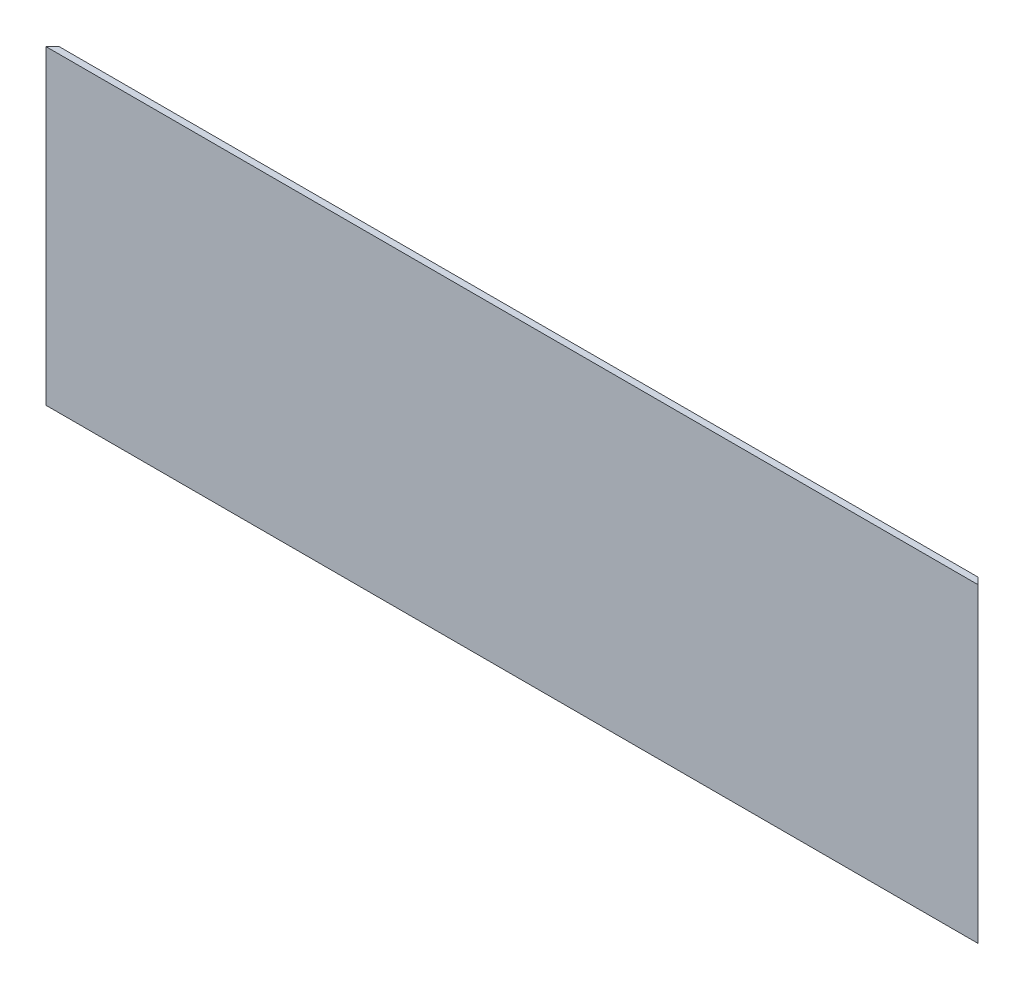
ISO-10303-21;
HEADER;
FILE_DESCRIPTION(('STEP AP214'),'2;1');
FILE_NAME('part.step','',(''),(''),'','','');
FILE_SCHEMA(('AUTOMOTIVE_DESIGN { 1 0 10303 214 1 1 1 1 }'));
ENDSEC;
DATA;
#1=APPLICATION_CONTEXT('core data for automotive mechanical design processes');
#2=APPLICATION_PROTOCOL_DEFINITION('international standard','automotive_design',2000,#1);
#3=PRODUCT_CONTEXT('',#1,'mechanical');
#4=PRODUCT('Part','Part','',(#3));
#5=PRODUCT_RELATED_PRODUCT_CATEGORY('part','',(#4));
#6=PRODUCT_DEFINITION_FORMATION('','',#4);
#7=PRODUCT_DEFINITION_CONTEXT('part definition',#1,'design');
#8=PRODUCT_DEFINITION('design','',#6,#7);
#9=PRODUCT_DEFINITION_SHAPE('','',#8);
#10=(LENGTH_UNIT() NAMED_UNIT(*) SI_UNIT(.MILLI.,.METRE.));
#11=(NAMED_UNIT(*) PLANE_ANGLE_UNIT() SI_UNIT($,.RADIAN.));
#12=(NAMED_UNIT(*) SI_UNIT($,.STERADIAN.) SOLID_ANGLE_UNIT());
#13=UNCERTAINTY_MEASURE_WITH_UNIT(LENGTH_MEASURE(1.E-05),#10,'distance_accuracy_value','');
#14=(GEOMETRIC_REPRESENTATION_CONTEXT(3) GLOBAL_UNCERTAINTY_ASSIGNED_CONTEXT((#13)) GLOBAL_UNIT_ASSIGNED_CONTEXT((#10,
#11,#12)) REPRESENTATION_CONTEXT('',''));
#15=CARTESIAN_POINT('',(0.,0.,0.));
#16=DIRECTION('',(0.,0.,1.));
#17=DIRECTION('',(1.,0.,0.));
#18=AXIS2_PLACEMENT_3D('',#15,#16,#17);
#19=CARTESIAN_POINT('',(0.,0.,3.175));
#20=DIRECTION('',(0.,1.,0.));
#21=DIRECTION('',(0.,0.,1.));
#22=AXIS2_PLACEMENT_3D('',#19,#20,#21);
#23=PLANE('',#22);
#24=DIRECTION('',(1.,0.,0.));
#25=VECTOR('',#24,1.);
#26=CARTESIAN_POINT('',(0.,0.,3.175));
#27=LINE('',#26,#25);
#28=CARTESIAN_POINT('',(0.,0.,3.175));
#29=VERTEX_POINT('',#28);
#30=CARTESIAN_POINT('',(450.,0.,3.175));
#31=VERTEX_POINT('',#30);
#32=EDGE_CURVE('E96',#29,#31,#27,.T.);
#33=ORIENTED_EDGE('',*,*,#32,.F.);
#34=DIRECTION('',(0.707106781186547,0.,-0.707106781186547));
#35=VECTOR('',#34,1.);
#36=CARTESIAN_POINT('',(0.,0.,3.175));
#37=LINE('',#36,#35);
#38=CARTESIAN_POINT('',(3.175,0.,0.));
#39=VERTEX_POINT('',#38);
#40=EDGE_CURVE('E84',#29,#39,#37,.T.);
#41=ORIENTED_EDGE('',*,*,#40,.T.);
#42=DIRECTION('',(1.,0.,0.));
#43=VECTOR('',#42,1.);
#44=CARTESIAN_POINT('',(0.,0.,0.));
#45=LINE('',#44,#43);
#46=CARTESIAN_POINT('',(446.825,0.,0.));
#47=VERTEX_POINT('',#46);
#48=EDGE_CURVE('E107',#39,#47,#45,.T.);
#49=ORIENTED_EDGE('',*,*,#48,.T.);
#50=DIRECTION('',(0.707106781186546,0.,0.707106781186549));
#51=VECTOR('',#50,1.);
#52=CARTESIAN_POINT('',(450.,0.,3.175));
#53=LINE('',#52,#51);
#54=EDGE_CURVE('E60',#47,#31,#53,.T.);
#55=ORIENTED_EDGE('',*,*,#54,.T.);
#56=EDGE_LOOP('',(#33,#41,#49,#55));
#57=FACE_BOUND('',#56,.T.);
#58=ADVANCED_FACE('F43',(#57),#23,.F.);
#59=CARTESIAN_POINT('',(0.,150.,3.175));
#60=DIRECTION('',(0.,-1.,0.));
#61=DIRECTION('',(0.,0.,-1.));
#62=AXIS2_PLACEMENT_3D('',#59,#60,#61);
#63=PLANE('',#62);
#64=DIRECTION('',(-1.,0.,0.));
#65=VECTOR('',#64,1.);
#66=CARTESIAN_POINT('',(0.,150.,0.));
#67=LINE('',#66,#65);
#68=CARTESIAN_POINT('',(446.825,150.,0.));
#69=VERTEX_POINT('',#68);
#70=CARTESIAN_POINT('',(3.175,150.,0.));
#71=VERTEX_POINT('',#70);
#72=EDGE_CURVE('E46',#69,#71,#67,.T.);
#73=ORIENTED_EDGE('',*,*,#72,.T.);
#74=DIRECTION('',(0.707106781186547,0.,-0.707106781186547));
#75=VECTOR('',#74,1.);
#76=CARTESIAN_POINT('',(0.,150.,3.175));
#77=LINE('',#76,#75);
#78=CARTESIAN_POINT('',(0.,150.,3.175));
#79=VERTEX_POINT('',#78);
#80=EDGE_CURVE('E68',#79,#71,#77,.T.);
#81=ORIENTED_EDGE('',*,*,#80,.F.);
#82=DIRECTION('',(-1.,0.,0.));
#83=VECTOR('',#82,1.);
#84=CARTESIAN_POINT('',(0.,150.,3.175));
#85=LINE('',#84,#83);
#86=CARTESIAN_POINT('',(450.,150.,3.175));
#87=VERTEX_POINT('',#86);
#88=EDGE_CURVE('E11',#87,#79,#85,.T.);
#89=ORIENTED_EDGE('',*,*,#88,.F.);
#90=DIRECTION('',(0.707106781186546,0.,0.707106781186549));
#91=VECTOR('',#90,1.);
#92=CARTESIAN_POINT('',(450.,150.,3.175));
#93=LINE('',#92,#91);
#94=EDGE_CURVE('E121',#69,#87,#93,.T.);
#95=ORIENTED_EDGE('',*,*,#94,.F.);
#96=EDGE_LOOP('',(#73,#81,#89,#95));
#97=FACE_BOUND('',#96,.T.);
#98=ADVANCED_FACE('F128',(#97),#63,.F.);
#99=CARTESIAN_POINT('',(0.,0.,3.175));
#100=DIRECTION('',(0.,0.,-1.));
#101=DIRECTION('',(-1.,0.,0.));
#102=AXIS2_PLACEMENT_3D('',#99,#100,#101);
#103=PLANE('',#102);
#104=DIRECTION('',(0.,-1.,0.));
#105=VECTOR('',#104,1.);
#106=CARTESIAN_POINT('',(0.,0.,3.175));
#107=LINE('',#106,#105);
#108=EDGE_CURVE('E88',#79,#29,#107,.T.);
#109=ORIENTED_EDGE('',*,*,#108,.T.);
#110=ORIENTED_EDGE('',*,*,#32,.T.);
#111=DIRECTION('',(0.,1.,0.));
#112=VECTOR('',#111,1.);
#113=CARTESIAN_POINT('',(450.,0.,3.175));
#114=LINE('',#113,#112);
#115=EDGE_CURVE('E52',#31,#87,#114,.T.);
#116=ORIENTED_EDGE('',*,*,#115,.T.);
#117=ORIENTED_EDGE('',*,*,#88,.T.);
#118=EDGE_LOOP('',(#109,#110,#116,#117));
#119=FACE_BOUND('',#118,.T.);
#120=ADVANCED_FACE('F101',(#119),#103,.F.);
#121=CARTESIAN_POINT('',(0.,0.,0.));
#122=DIRECTION('',(0.,0.,-1.));
#123=DIRECTION('',(-1.,0.,0.));
#124=AXIS2_PLACEMENT_3D('',#121,#122,#123);
#125=PLANE('',#124);
#126=DIRECTION('',(0.,1.,0.));
#127=VECTOR('',#126,1.);
#128=CARTESIAN_POINT('',(3.175,0.,0.));
#129=LINE('',#128,#127);
#130=EDGE_CURVE('E89',#39,#71,#129,.T.);
#131=ORIENTED_EDGE('',*,*,#130,.T.);
#132=ORIENTED_EDGE('',*,*,#72,.F.);
#133=DIRECTION('',(0.,1.,0.));
#134=VECTOR('',#133,1.);
#135=CARTESIAN_POINT('',(446.825,0.,0.));
#136=LINE('',#135,#134);
#137=EDGE_CURVE('E119',#47,#69,#136,.T.);
#138=ORIENTED_EDGE('',*,*,#137,.F.);
#139=ORIENTED_EDGE('',*,*,#48,.F.);
#140=EDGE_LOOP('',(#131,#132,#138,#139));
#141=FACE_BOUND('',#140,.T.);
#142=ADVANCED_FACE('F129',(#141),#125,.T.);
#143=CARTESIAN_POINT('',(450.,0.,3.175));
#144=DIRECTION('',(-0.707106781186549,0.,0.707106781186546));
#145=DIRECTION('',(0.707106781186546,0.,0.707106781186549));
#146=AXIS2_PLACEMENT_3D('',#143,#144,#145);
#147=PLANE('',#146);
#148=ORIENTED_EDGE('',*,*,#94,.T.);
#149=ORIENTED_EDGE('',*,*,#115,.F.);
#150=ORIENTED_EDGE('',*,*,#54,.F.);
#151=ORIENTED_EDGE('',*,*,#137,.T.);
#152=EDGE_LOOP('',(#148,#149,#150,#151));
#153=FACE_BOUND('',#152,.T.);
#154=ADVANCED_FACE('F126',(#153),#147,.F.);
#155=CARTESIAN_POINT('',(0.,0.,3.175));
#156=DIRECTION('',(0.707106781186548,0.,0.707106781186548));
#157=DIRECTION('',(0.707106781186548,0.,-0.707106781186548));
#158=AXIS2_PLACEMENT_3D('',#155,#156,#157);
#159=PLANE('',#158);
#160=ORIENTED_EDGE('',*,*,#80,.T.);
#161=ORIENTED_EDGE('',*,*,#130,.F.);
#162=ORIENTED_EDGE('',*,*,#40,.F.);
#163=ORIENTED_EDGE('',*,*,#108,.F.);
#164=EDGE_LOOP('',(#160,#161,#162,#163));
#165=FACE_BOUND('',#164,.T.);
#166=ADVANCED_FACE('F86',(#165),#159,.F.);
#167=CLOSED_SHELL('',(#58,#98,#120,#142,#154,#166));
#168=MANIFOLD_SOLID_BREP('B2',#167);
#169=ADVANCED_BREP_SHAPE_REPRESENTATION('',(#18,#168),#14);
#170=SHAPE_DEFINITION_REPRESENTATION(#9,#169);
ENDSEC;
END-ISO-10303-21;
